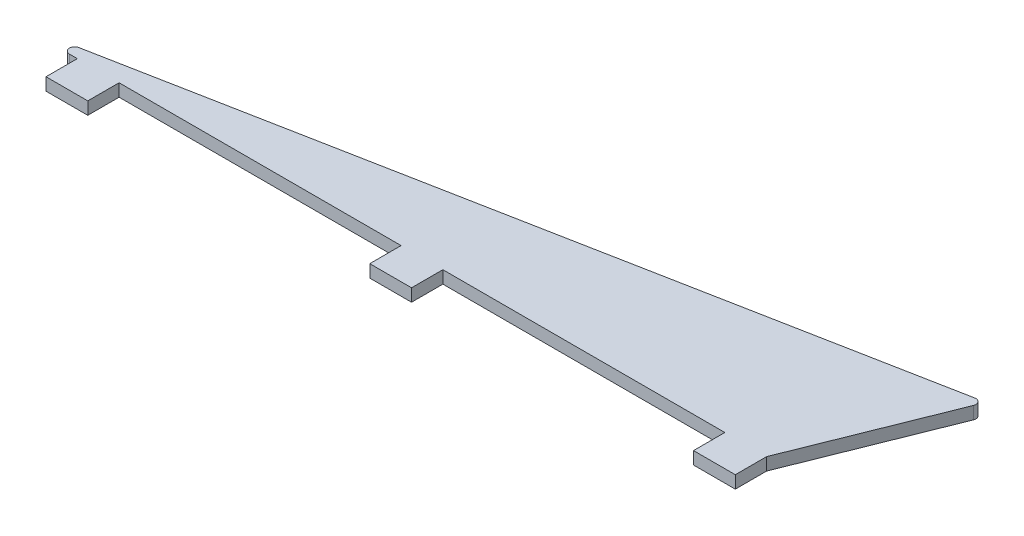
ISO-10303-21;
HEADER;
FILE_DESCRIPTION(('STEP AP214'),'2;1');
FILE_NAME('part.step','',(''),(''),'','','');
FILE_SCHEMA(('AUTOMOTIVE_DESIGN { 1 0 10303 214 1 1 1 1 }'));
ENDSEC;
DATA;
#1=APPLICATION_CONTEXT('core data for automotive mechanical design processes');
#2=APPLICATION_PROTOCOL_DEFINITION('international standard','automotive_design',2000,#1);
#3=PRODUCT_CONTEXT('',#1,'mechanical');
#4=PRODUCT('Part','Part','',(#3));
#5=PRODUCT_RELATED_PRODUCT_CATEGORY('part','',(#4));
#6=PRODUCT_DEFINITION_FORMATION('','',#4);
#7=PRODUCT_DEFINITION_CONTEXT('part definition',#1,'design');
#8=PRODUCT_DEFINITION('design','',#6,#7);
#9=PRODUCT_DEFINITION_SHAPE('','',#8);
#10=(LENGTH_UNIT() NAMED_UNIT(*) SI_UNIT(.MILLI.,.METRE.));
#11=(NAMED_UNIT(*) PLANE_ANGLE_UNIT() SI_UNIT($,.RADIAN.));
#12=(NAMED_UNIT(*) SI_UNIT($,.STERADIAN.) SOLID_ANGLE_UNIT());
#13=UNCERTAINTY_MEASURE_WITH_UNIT(LENGTH_MEASURE(1.E-05),#10,'distance_accuracy_value','');
#14=(GEOMETRIC_REPRESENTATION_CONTEXT(3) GLOBAL_UNCERTAINTY_ASSIGNED_CONTEXT((#13)) GLOBAL_UNIT_ASSIGNED_CONTEXT((#10,
#11,#12)) REPRESENTATION_CONTEXT('',''));
#15=CARTESIAN_POINT('',(0.,0.,0.));
#16=DIRECTION('',(0.,0.,1.));
#17=DIRECTION('',(1.,0.,0.));
#18=AXIS2_PLACEMENT_3D('',#15,#16,#17);
#19=CARTESIAN_POINT('',(0.,6.,0.));
#20=DIRECTION('',(1.,0.,0.));
#21=DIRECTION('',(0.,0.,-1.));
#22=AXIS2_PLACEMENT_3D('',#19,#20,#21);
#23=PLANE('',#22);
#24=DIRECTION('',(0.,0.,1.));
#25=VECTOR('',#24,1.);
#26=CARTESIAN_POINT('',(0.,0.,0.));
#27=LINE('',#26,#25);
#28=CARTESIAN_POINT('',(0.,0.,-15.));
#29=VERTEX_POINT('',#28);
#30=CARTESIAN_POINT('',(0.,0.,0.));
#31=VERTEX_POINT('',#30);
#32=EDGE_CURVE('E183',#29,#31,#27,.T.);
#33=ORIENTED_EDGE('',*,*,#32,.T.);
#34=DIRECTION('',(0.,-1.,0.));
#35=VECTOR('',#34,1.);
#36=CARTESIAN_POINT('',(0.,6.,0.));
#37=LINE('',#36,#35);
#38=CARTESIAN_POINT('',(0.,6.,0.));
#39=VERTEX_POINT('',#38);
#40=EDGE_CURVE('E11',#39,#31,#37,.T.);
#41=ORIENTED_EDGE('',*,*,#40,.F.);
#42=DIRECTION('',(0.,0.,1.));
#43=VECTOR('',#42,1.);
#44=CARTESIAN_POINT('',(0.,6.,0.));
#45=LINE('',#44,#43);
#46=CARTESIAN_POINT('',(0.,6.,-15.));
#47=VERTEX_POINT('',#46);
#48=EDGE_CURVE('E213',#47,#39,#45,.T.);
#49=ORIENTED_EDGE('',*,*,#48,.F.);
#50=DIRECTION('',(0.,-1.,0.));
#51=VECTOR('',#50,1.);
#52=CARTESIAN_POINT('',(0.,6.,-15.));
#53=LINE('',#52,#51);
#54=EDGE_CURVE('E179',#47,#29,#53,.T.);
#55=ORIENTED_EDGE('',*,*,#54,.T.);
#56=EDGE_LOOP('',(#33,#41,#49,#55));
#57=FACE_BOUND('',#56,.T.);
#58=ADVANCED_FACE('F39',(#57),#23,.F.);
#59=CARTESIAN_POINT('',(0.,6.,0.));
#60=DIRECTION('',(0.,0.,-1.));
#61=DIRECTION('',(-1.,0.,0.));
#62=AXIS2_PLACEMENT_3D('',#59,#60,#61);
#63=PLANE('',#62);
#64=DIRECTION('',(1.,0.,0.));
#65=VECTOR('',#64,1.);
#66=CARTESIAN_POINT('',(0.,0.,0.));
#67=LINE('',#66,#65);
#68=CARTESIAN_POINT('',(20.,0.,0.));
#69=VERTEX_POINT('',#68);
#70=EDGE_CURVE('E186',#31,#69,#67,.T.);
#71=ORIENTED_EDGE('',*,*,#70,.T.);
#72=DIRECTION('',(0.,-1.,0.));
#73=VECTOR('',#72,1.);
#74=CARTESIAN_POINT('',(20.,6.,0.));
#75=LINE('',#74,#73);
#76=CARTESIAN_POINT('',(20.,6.,0.));
#77=VERTEX_POINT('',#76);
#78=EDGE_CURVE('E47',#77,#69,#75,.T.);
#79=ORIENTED_EDGE('',*,*,#78,.F.);
#80=DIRECTION('',(1.,0.,0.));
#81=VECTOR('',#80,1.);
#82=CARTESIAN_POINT('',(0.,6.,0.));
#83=LINE('',#82,#81);
#84=EDGE_CURVE('E122',#39,#77,#83,.T.);
#85=ORIENTED_EDGE('',*,*,#84,.F.);
#86=ORIENTED_EDGE('',*,*,#40,.T.);
#87=EDGE_LOOP('',(#71,#79,#85,#86));
#88=FACE_BOUND('',#87,.T.);
#89=ADVANCED_FACE('F311',(#88),#63,.F.);
#90=CARTESIAN_POINT('',(20.,6.,0.));
#91=DIRECTION('',(-1.,0.,0.));
#92=DIRECTION('',(0.,0.,1.));
#93=AXIS2_PLACEMENT_3D('',#90,#91,#92);
#94=PLANE('',#93);
#95=DIRECTION('',(0.,0.,-1.));
#96=VECTOR('',#95,1.);
#97=CARTESIAN_POINT('',(20.,0.,0.));
#98=LINE('',#97,#96);
#99=CARTESIAN_POINT('',(20.,0.,-15.));
#100=VERTEX_POINT('',#99);
#101=EDGE_CURVE('E188',#69,#100,#98,.T.);
#102=ORIENTED_EDGE('',*,*,#101,.T.);
#103=DIRECTION('',(0.,-1.,0.));
#104=VECTOR('',#103,1.);
#105=CARTESIAN_POINT('',(20.,6.,-15.));
#106=LINE('',#105,#104);
#107=CARTESIAN_POINT('',(20.,6.,-15.));
#108=VERTEX_POINT('',#107);
#109=EDGE_CURVE('E244',#108,#100,#106,.T.);
#110=ORIENTED_EDGE('',*,*,#109,.F.);
#111=DIRECTION('',(0.,0.,-1.));
#112=VECTOR('',#111,1.);
#113=CARTESIAN_POINT('',(20.,6.,0.));
#114=LINE('',#113,#112);
#115=EDGE_CURVE('E252',#77,#108,#114,.T.);
#116=ORIENTED_EDGE('',*,*,#115,.F.);
#117=ORIENTED_EDGE('',*,*,#78,.T.);
#118=EDGE_LOOP('',(#102,#110,#116,#117));
#119=FACE_BOUND('',#118,.T.);
#120=ADVANCED_FACE('F250',(#119),#94,.F.);
#121=CARTESIAN_POINT('',(20.,6.,-15.));
#122=DIRECTION('',(0.,0.,-1.));
#123=DIRECTION('',(-1.,0.,0.));
#124=AXIS2_PLACEMENT_3D('',#121,#122,#123);
#125=PLANE('',#124);
#126=DIRECTION('',(1.,0.,0.));
#127=VECTOR('',#126,1.);
#128=CARTESIAN_POINT('',(20.,0.,-15.));
#129=LINE('',#128,#127);
#130=CARTESIAN_POINT('',(155.,0.,-15.));
#131=VERTEX_POINT('',#130);
#132=EDGE_CURVE('E190',#100,#131,#129,.T.);
#133=ORIENTED_EDGE('',*,*,#132,.T.);
#134=DIRECTION('',(0.,-1.,0.));
#135=VECTOR('',#134,1.);
#136=CARTESIAN_POINT('',(155.,6.,-15.));
#137=LINE('',#136,#135);
#138=CARTESIAN_POINT('',(155.,6.,-15.));
#139=VERTEX_POINT('',#138);
#140=EDGE_CURVE('E241',#139,#131,#137,.T.);
#141=ORIENTED_EDGE('',*,*,#140,.F.);
#142=DIRECTION('',(1.,0.,0.));
#143=VECTOR('',#142,1.);
#144=CARTESIAN_POINT('',(20.,6.,-15.));
#145=LINE('',#144,#143);
#146=EDGE_CURVE('E270',#108,#139,#145,.T.);
#147=ORIENTED_EDGE('',*,*,#146,.F.);
#148=ORIENTED_EDGE('',*,*,#109,.T.);
#149=EDGE_LOOP('',(#133,#141,#147,#148));
#150=FACE_BOUND('',#149,.T.);
#151=ADVANCED_FACE('F261',(#150),#125,.F.);
#152=CARTESIAN_POINT('',(155.,6.,-15.));
#153=DIRECTION('',(1.,0.,0.));
#154=DIRECTION('',(0.,0.,-1.));
#155=AXIS2_PLACEMENT_3D('',#152,#153,#154);
#156=PLANE('',#155);
#157=DIRECTION('',(0.,0.,1.));
#158=VECTOR('',#157,1.);
#159=CARTESIAN_POINT('',(155.,0.,-15.));
#160=LINE('',#159,#158);
#161=CARTESIAN_POINT('',(155.,0.,0.));
#162=VERTEX_POINT('',#161);
#163=EDGE_CURVE('E192',#131,#162,#160,.T.);
#164=ORIENTED_EDGE('',*,*,#163,.T.);
#165=DIRECTION('',(0.,-1.,0.));
#166=VECTOR('',#165,1.);
#167=CARTESIAN_POINT('',(155.,6.,0.));
#168=LINE('',#167,#166);
#169=CARTESIAN_POINT('',(155.,6.,0.));
#170=VERTEX_POINT('',#169);
#171=EDGE_CURVE('E238',#170,#162,#168,.T.);
#172=ORIENTED_EDGE('',*,*,#171,.F.);
#173=DIRECTION('',(0.,0.,1.));
#174=VECTOR('',#173,1.);
#175=CARTESIAN_POINT('',(155.,6.,-15.));
#176=LINE('',#175,#174);
#177=EDGE_CURVE('E267',#139,#170,#176,.T.);
#178=ORIENTED_EDGE('',*,*,#177,.F.);
#179=ORIENTED_EDGE('',*,*,#140,.T.);
#180=EDGE_LOOP('',(#164,#172,#178,#179));
#181=FACE_BOUND('',#180,.T.);
#182=ADVANCED_FACE('F265',(#181),#156,.F.);
#183=CARTESIAN_POINT('',(155.,6.,0.));
#184=DIRECTION('',(0.,0.,-1.));
#185=DIRECTION('',(-1.,0.,0.));
#186=AXIS2_PLACEMENT_3D('',#183,#184,#185);
#187=PLANE('',#186);
#188=DIRECTION('',(1.,0.,0.));
#189=VECTOR('',#188,1.);
#190=CARTESIAN_POINT('',(155.,0.,0.));
#191=LINE('',#190,#189);
#192=CARTESIAN_POINT('',(175.,0.,0.));
#193=VERTEX_POINT('',#192);
#194=EDGE_CURVE('E194',#162,#193,#191,.T.);
#195=ORIENTED_EDGE('',*,*,#194,.T.);
#196=DIRECTION('',(0.,-1.,0.));
#197=VECTOR('',#196,1.);
#198=CARTESIAN_POINT('',(175.,6.,0.));
#199=LINE('',#198,#197);
#200=CARTESIAN_POINT('',(175.,6.,0.));
#201=VERTEX_POINT('',#200);
#202=EDGE_CURVE('E235',#201,#193,#199,.T.);
#203=ORIENTED_EDGE('',*,*,#202,.F.);
#204=DIRECTION('',(1.,0.,0.));
#205=VECTOR('',#204,1.);
#206=CARTESIAN_POINT('',(155.,6.,0.));
#207=LINE('',#206,#205);
#208=EDGE_CURVE('E269',#170,#201,#207,.T.);
#209=ORIENTED_EDGE('',*,*,#208,.F.);
#210=ORIENTED_EDGE('',*,*,#171,.T.);
#211=EDGE_LOOP('',(#195,#203,#209,#210));
#212=FACE_BOUND('',#211,.T.);
#213=ADVANCED_FACE('F324',(#212),#187,.F.);
#214=CARTESIAN_POINT('',(175.,6.,0.));
#215=DIRECTION('',(-1.,0.,0.));
#216=DIRECTION('',(0.,0.,1.));
#217=AXIS2_PLACEMENT_3D('',#214,#215,#216);
#218=PLANE('',#217);
#219=DIRECTION('',(0.,0.,-1.));
#220=VECTOR('',#219,1.);
#221=CARTESIAN_POINT('',(175.,0.,0.));
#222=LINE('',#221,#220);
#223=CARTESIAN_POINT('',(175.,0.,-15.));
#224=VERTEX_POINT('',#223);
#225=EDGE_CURVE('E196',#193,#224,#222,.T.);
#226=ORIENTED_EDGE('',*,*,#225,.T.);
#227=DIRECTION('',(0.,-1.,0.));
#228=VECTOR('',#227,1.);
#229=CARTESIAN_POINT('',(175.,6.,-15.));
#230=LINE('',#229,#228);
#231=CARTESIAN_POINT('',(175.,6.,-15.));
#232=VERTEX_POINT('',#231);
#233=EDGE_CURVE('E232',#232,#224,#230,.T.);
#234=ORIENTED_EDGE('',*,*,#233,.F.);
#235=DIRECTION('',(0.,0.,-1.));
#236=VECTOR('',#235,1.);
#237=CARTESIAN_POINT('',(175.,6.,0.));
#238=LINE('',#237,#236);
#239=EDGE_CURVE('E272',#201,#232,#238,.T.);
#240=ORIENTED_EDGE('',*,*,#239,.F.);
#241=ORIENTED_EDGE('',*,*,#202,.T.);
#242=EDGE_LOOP('',(#226,#234,#240,#241));
#243=FACE_BOUND('',#242,.T.);
#244=ADVANCED_FACE('F327',(#243),#218,.F.);
#245=CARTESIAN_POINT('',(175.,6.,-15.));
#246=DIRECTION('',(0.,0.,-1.));
#247=DIRECTION('',(-1.,0.,0.));
#248=AXIS2_PLACEMENT_3D('',#245,#246,#247);
#249=PLANE('',#248);
#250=DIRECTION('',(1.,0.,0.));
#251=VECTOR('',#250,1.);
#252=CARTESIAN_POINT('',(175.,0.,-15.));
#253=LINE('',#252,#251);
#254=CARTESIAN_POINT('',(310.,0.,-15.));
#255=VERTEX_POINT('',#254);
#256=EDGE_CURVE('E198',#224,#255,#253,.T.);
#257=ORIENTED_EDGE('',*,*,#256,.T.);
#258=DIRECTION('',(0.,-1.,0.));
#259=VECTOR('',#258,1.);
#260=CARTESIAN_POINT('',(310.,6.,-15.));
#261=LINE('',#260,#259);
#262=CARTESIAN_POINT('',(310.,6.,-15.));
#263=VERTEX_POINT('',#262);
#264=EDGE_CURVE('E229',#263,#255,#261,.T.);
#265=ORIENTED_EDGE('',*,*,#264,.F.);
#266=DIRECTION('',(1.,0.,0.));
#267=VECTOR('',#266,1.);
#268=CARTESIAN_POINT('',(175.,6.,-15.));
#269=LINE('',#268,#267);
#270=EDGE_CURVE('E278',#232,#263,#269,.T.);
#271=ORIENTED_EDGE('',*,*,#270,.F.);
#272=ORIENTED_EDGE('',*,*,#233,.T.);
#273=EDGE_LOOP('',(#257,#265,#271,#272));
#274=FACE_BOUND('',#273,.T.);
#275=ADVANCED_FACE('F331',(#274),#249,.F.);
#276=CARTESIAN_POINT('',(310.,6.,-15.));
#277=DIRECTION('',(1.,0.,0.));
#278=DIRECTION('',(0.,0.,-1.));
#279=AXIS2_PLACEMENT_3D('',#276,#277,#278);
#280=PLANE('',#279);
#281=DIRECTION('',(0.,0.,1.));
#282=VECTOR('',#281,1.);
#283=CARTESIAN_POINT('',(310.,0.,-15.));
#284=LINE('',#283,#282);
#285=CARTESIAN_POINT('',(310.,0.,0.));
#286=VERTEX_POINT('',#285);
#287=EDGE_CURVE('E200',#255,#286,#284,.T.);
#288=ORIENTED_EDGE('',*,*,#287,.T.);
#289=DIRECTION('',(0.,-1.,0.));
#290=VECTOR('',#289,1.);
#291=CARTESIAN_POINT('',(310.,6.,0.));
#292=LINE('',#291,#290);
#293=CARTESIAN_POINT('',(310.,6.,0.));
#294=VERTEX_POINT('',#293);
#295=EDGE_CURVE('E226',#294,#286,#292,.T.);
#296=ORIENTED_EDGE('',*,*,#295,.F.);
#297=DIRECTION('',(0.,0.,1.));
#298=VECTOR('',#297,1.);
#299=CARTESIAN_POINT('',(310.,6.,-15.));
#300=LINE('',#299,#298);
#301=EDGE_CURVE('E280',#263,#294,#300,.T.);
#302=ORIENTED_EDGE('',*,*,#301,.F.);
#303=ORIENTED_EDGE('',*,*,#264,.T.);
#304=EDGE_LOOP('',(#288,#296,#302,#303));
#305=FACE_BOUND('',#304,.T.);
#306=ADVANCED_FACE('F335',(#305),#280,.F.);
#307=CARTESIAN_POINT('',(310.,6.,0.));
#308=DIRECTION('',(0.,0.,-1.));
#309=DIRECTION('',(-1.,0.,0.));
#310=AXIS2_PLACEMENT_3D('',#307,#308,#309);
#311=PLANE('',#310);
#312=DIRECTION('',(1.,0.,0.));
#313=VECTOR('',#312,1.);
#314=CARTESIAN_POINT('',(310.,0.,0.));
#315=LINE('',#314,#313);
#316=CARTESIAN_POINT('',(330.,0.,0.));
#317=VERTEX_POINT('',#316);
#318=EDGE_CURVE('E202',#286,#317,#315,.T.);
#319=ORIENTED_EDGE('',*,*,#318,.T.);
#320=DIRECTION('',(0.,-1.,0.));
#321=VECTOR('',#320,1.);
#322=CARTESIAN_POINT('',(330.,6.,0.));
#323=LINE('',#322,#321);
#324=CARTESIAN_POINT('',(330.,6.,0.));
#325=VERTEX_POINT('',#324);
#326=EDGE_CURVE('E223',#325,#317,#323,.T.);
#327=ORIENTED_EDGE('',*,*,#326,.F.);
#328=DIRECTION('',(1.,0.,0.));
#329=VECTOR('',#328,1.);
#330=CARTESIAN_POINT('',(310.,6.,0.));
#331=LINE('',#330,#329);
#332=EDGE_CURVE('E282',#294,#325,#331,.T.);
#333=ORIENTED_EDGE('',*,*,#332,.F.);
#334=ORIENTED_EDGE('',*,*,#295,.T.);
#335=EDGE_LOOP('',(#319,#327,#333,#334));
#336=FACE_BOUND('',#335,.T.);
#337=ADVANCED_FACE('F339',(#336),#311,.F.);
#338=CARTESIAN_POINT('',(330.,6.,0.));
#339=DIRECTION('',(-1.,0.,0.));
#340=DIRECTION('',(0.,0.,1.));
#341=AXIS2_PLACEMENT_3D('',#338,#339,#340);
#342=PLANE('',#341);
#343=DIRECTION('',(0.,0.,-1.));
#344=VECTOR('',#343,1.);
#345=CARTESIAN_POINT('',(330.,0.,0.));
#346=LINE('',#345,#344);
#347=CARTESIAN_POINT('',(330.,0.,-15.));
#348=VERTEX_POINT('',#347);
#349=EDGE_CURVE('E204',#317,#348,#346,.T.);
#350=ORIENTED_EDGE('',*,*,#349,.T.);
#351=DIRECTION('',(0.,-1.,0.));
#352=VECTOR('',#351,1.);
#353=CARTESIAN_POINT('',(330.,6.,-15.));
#354=LINE('',#353,#352);
#355=CARTESIAN_POINT('',(330.,6.,-15.));
#356=VERTEX_POINT('',#355);
#357=EDGE_CURVE('E220',#356,#348,#354,.T.);
#358=ORIENTED_EDGE('',*,*,#357,.F.);
#359=DIRECTION('',(0.,0.,-1.));
#360=VECTOR('',#359,1.);
#361=CARTESIAN_POINT('',(330.,6.,0.));
#362=LINE('',#361,#360);
#363=EDGE_CURVE('E284',#325,#356,#362,.T.);
#364=ORIENTED_EDGE('',*,*,#363,.F.);
#365=ORIENTED_EDGE('',*,*,#326,.T.);
#366=EDGE_LOOP('',(#350,#358,#364,#365));
#367=FACE_BOUND('',#366,.T.);
#368=ADVANCED_FACE('F343',(#367),#342,.F.);
#369=CARTESIAN_POINT('',(330.,6.,-15.));
#370=DIRECTION('',(-0.92847669088526,0.,-0.371390676354103));
#371=DIRECTION('',(-0.371390676354103,0.,0.92847669088526));
#372=AXIS2_PLACEMENT_3D('',#369,#370,#371);
#373=PLANE('',#372);
#374=DIRECTION('',(0.371390676354103,0.,-0.92847669088526));
#375=VECTOR('',#374,1.);
#376=CARTESIAN_POINT('',(330.,0.,-15.));
#377=LINE('',#376,#375);
#378=CARTESIAN_POINT('',(358.301043932109,0.,-85.7526098302728));
#379=VERTEX_POINT('',#378);
#380=EDGE_CURVE('E206',#348,#379,#377,.T.);
#381=ORIENTED_EDGE('',*,*,#380,.T.);
#382=DIRECTION('',(0.,-1.,0.));
#383=VECTOR('',#382,1.);
#384=CARTESIAN_POINT('',(358.301043932109,6.,-85.7526098302728));
#385=LINE('',#384,#383);
#386=CARTESIAN_POINT('',(358.301043932109,6.,-85.7526098302728));
#387=VERTEX_POINT('',#386);
#388=EDGE_CURVE('E217',#387,#379,#385,.T.);
#389=ORIENTED_EDGE('',*,*,#388,.F.);
#390=DIRECTION('',(0.371390676354103,0.,-0.92847669088526));
#391=VECTOR('',#390,1.);
#392=CARTESIAN_POINT('',(330.,6.,-15.));
#393=LINE('',#392,#391);
#394=EDGE_CURVE('E286',#356,#387,#393,.T.);
#395=ORIENTED_EDGE('',*,*,#394,.F.);
#396=ORIENTED_EDGE('',*,*,#357,.T.);
#397=EDGE_LOOP('',(#381,#389,#395,#396));
#398=FACE_BOUND('',#397,.T.);
#399=ADVANCED_FACE('F292',(#398),#373,.F.);
#400=CARTESIAN_POINT('',(355.979852204896,6.,-86.6810865211581));
#401=DIRECTION('',(0.,-1.,0.));
#402=DIRECTION('',(0.,0.,-1.));
#403=AXIS2_PLACEMENT_3D('',#400,#401,#402);
#404=CYLINDRICAL_SURFACE('',#403,2.5);
#405=CARTESIAN_POINT('',(355.979852204896,0.,-86.6810865211581));
#406=DIRECTION('',(0.,1.,0.));
#407=DIRECTION('',(0.,0.,-1.));
#408=AXIS2_PLACEMENT_3D('',#405,#406,#407);
#409=CIRCLE('',#408,2.5);
#410=CARTESIAN_POINT('',(355.507733720771,0.,-89.1361026386097));
#411=VERTEX_POINT('',#410);
#412=EDGE_CURVE('E208',#379,#411,#409,.T.);
#413=ORIENTED_EDGE('',*,*,#412,.T.);
#414=DIRECTION('',(0.,-1.,0.));
#415=VECTOR('',#414,1.);
#416=CARTESIAN_POINT('',(355.507733720771,6.,-89.1361026386097));
#417=LINE('',#416,#415);
#418=CARTESIAN_POINT('',(355.507733720771,6.,-89.1361026386097));
#419=VERTEX_POINT('',#418);
#420=EDGE_CURVE('E174',#419,#411,#417,.T.);
#421=ORIENTED_EDGE('',*,*,#420,.F.);
#422=CARTESIAN_POINT('',(355.979852204896,6.,-86.6810865211581));
#423=DIRECTION('',(0.,1.,0.));
#424=DIRECTION('',(0.,0.,-1.));
#425=AXIS2_PLACEMENT_3D('',#422,#423,#424);
#426=CIRCLE('',#425,2.5);
#427=EDGE_CURVE('E165',#387,#419,#426,.T.);
#428=ORIENTED_EDGE('',*,*,#427,.F.);
#429=ORIENTED_EDGE('',*,*,#388,.T.);
#430=EDGE_LOOP('',(#413,#421,#428,#429));
#431=FACE_BOUND('',#430,.T.);
#432=ADVANCED_FACE('F296',(#431),#404,.T.);
#433=CARTESIAN_POINT('',(-4.23391618925061,6.,-19.9550161174518));
#434=DIRECTION('',(0.188847393650124,0.,0.982006446980647));
#435=DIRECTION('',(0.982006446980647,0.,-0.188847393650124));
#436=AXIS2_PLACEMENT_3D('',#433,#434,#435);
#437=PLANE('',#436);
#438=DIRECTION('',(-0.982006446980647,0.,0.188847393650124));
#439=VECTOR('',#438,1.);
#440=CARTESIAN_POINT('',(-4.23391618925061,0.,-19.9550161174518));
#441=LINE('',#440,#439);
#442=CARTESIAN_POINT('',(-4.23391618925061,0.,-19.9550161174518));
#443=VERTEX_POINT('',#442);
#444=EDGE_CURVE('E173',#411,#443,#441,.T.);
#445=ORIENTED_EDGE('',*,*,#444,.T.);
#446=DIRECTION('',(0.,-1.,0.));
#447=VECTOR('',#446,1.);
#448=CARTESIAN_POINT('',(-4.23391618925061,6.,-19.9550161174518));
#449=LINE('',#448,#447);
#450=CARTESIAN_POINT('',(-4.23391618925061,6.,-19.9550161174518));
#451=VERTEX_POINT('',#450);
#452=EDGE_CURVE('E170',#451,#443,#449,.T.);
#453=ORIENTED_EDGE('',*,*,#452,.F.);
#454=DIRECTION('',(-0.982006446980647,0.,0.188847393650124));
#455=VECTOR('',#454,1.);
#456=CARTESIAN_POINT('',(-4.23391618925061,6.,-19.9550161174518));
#457=LINE('',#456,#455);
#458=EDGE_CURVE('E159',#419,#451,#457,.T.);
#459=ORIENTED_EDGE('',*,*,#458,.F.);
#460=ORIENTED_EDGE('',*,*,#420,.T.);
#461=EDGE_LOOP('',(#445,#453,#459,#460));
#462=FACE_BOUND('',#461,.T.);
#463=ADVANCED_FACE('F171',(#462),#437,.F.);
#464=CARTESIAN_POINT('',(-3.76179770512627,6.,-17.5));
#465=DIRECTION('',(0.,-1.,0.));
#466=DIRECTION('',(0.,0.,-1.));
#467=AXIS2_PLACEMENT_3D('',#464,#465,#466);
#468=CYLINDRICAL_SURFACE('',#467,2.5);
#469=CARTESIAN_POINT('',(-3.76179770512627,0.,-17.5));
#470=DIRECTION('',(0.,1.,0.));
#471=DIRECTION('',(0.,0.,-1.));
#472=AXIS2_PLACEMENT_3D('',#469,#470,#471);
#473=CIRCLE('',#472,2.5);
#474=CARTESIAN_POINT('',(-3.76179770512528,0.,-15.));
#475=VERTEX_POINT('',#474);
#476=EDGE_CURVE('E108',#443,#475,#473,.T.);
#477=ORIENTED_EDGE('',*,*,#476,.T.);
#478=DIRECTION('',(0.,-1.,0.));
#479=VECTOR('',#478,1.);
#480=CARTESIAN_POINT('',(-3.76179770512528,6.,-15.));
#481=LINE('',#480,#479);
#482=CARTESIAN_POINT('',(-3.76179770512528,6.,-15.));
#483=VERTEX_POINT('',#482);
#484=EDGE_CURVE('E175',#483,#475,#481,.T.);
#485=ORIENTED_EDGE('',*,*,#484,.F.);
#486=CARTESIAN_POINT('',(-3.76179770512627,6.,-17.5));
#487=DIRECTION('',(0.,1.,0.));
#488=DIRECTION('',(0.,0.,-1.));
#489=AXIS2_PLACEMENT_3D('',#486,#487,#488);
#490=CIRCLE('',#489,2.5);
#491=EDGE_CURVE('E163',#451,#483,#490,.T.);
#492=ORIENTED_EDGE('',*,*,#491,.F.);
#493=ORIENTED_EDGE('',*,*,#452,.T.);
#494=EDGE_LOOP('',(#477,#485,#492,#493));
#495=FACE_BOUND('',#494,.T.);
#496=ADVANCED_FACE('F177',(#495),#468,.T.);
#497=CARTESIAN_POINT('',(-3.76179770512528,6.,-15.));
#498=DIRECTION('',(0.,0.,-1.));
#499=DIRECTION('',(-1.,0.,0.));
#500=AXIS2_PLACEMENT_3D('',#497,#498,#499);
#501=PLANE('',#500);
#502=DIRECTION('',(1.,0.,0.));
#503=VECTOR('',#502,1.);
#504=CARTESIAN_POINT('',(-3.76179770512528,0.,-15.));
#505=LINE('',#504,#503);
#506=EDGE_CURVE('E114',#475,#29,#505,.T.);
#507=ORIENTED_EDGE('',*,*,#506,.T.);
#508=ORIENTED_EDGE('',*,*,#54,.F.);
#509=DIRECTION('',(1.,0.,0.));
#510=VECTOR('',#509,1.);
#511=CARTESIAN_POINT('',(-3.76179770512528,6.,-15.));
#512=LINE('',#511,#510);
#513=EDGE_CURVE('E55',#483,#47,#512,.T.);
#514=ORIENTED_EDGE('',*,*,#513,.F.);
#515=ORIENTED_EDGE('',*,*,#484,.T.);
#516=EDGE_LOOP('',(#507,#508,#514,#515));
#517=FACE_BOUND('',#516,.T.);
#518=ADVANCED_FACE('F300',(#517),#501,.F.);
#519=CARTESIAN_POINT('',(-3.76179770512627,6.,-17.5));
#520=DIRECTION('',(0.,-1.,0.));
#521=DIRECTION('',(0.,0.,-1.));
#522=AXIS2_PLACEMENT_3D('',#519,#520,#521);
#523=PLANE('',#522);
#524=ORIENTED_EDGE('',*,*,#48,.T.);
#525=ORIENTED_EDGE('',*,*,#84,.T.);
#526=ORIENTED_EDGE('',*,*,#115,.T.);
#527=ORIENTED_EDGE('',*,*,#146,.T.);
#528=ORIENTED_EDGE('',*,*,#177,.T.);
#529=ORIENTED_EDGE('',*,*,#208,.T.);
#530=ORIENTED_EDGE('',*,*,#239,.T.);
#531=ORIENTED_EDGE('',*,*,#270,.T.);
#532=ORIENTED_EDGE('',*,*,#301,.T.);
#533=ORIENTED_EDGE('',*,*,#332,.T.);
#534=ORIENTED_EDGE('',*,*,#363,.T.);
#535=ORIENTED_EDGE('',*,*,#394,.T.);
#536=ORIENTED_EDGE('',*,*,#427,.T.);
#537=ORIENTED_EDGE('',*,*,#458,.T.);
#538=ORIENTED_EDGE('',*,*,#491,.T.);
#539=ORIENTED_EDGE('',*,*,#513,.T.);
#540=EDGE_LOOP('',(#524,#525,#526,#527,#528,#529,#530,#531,#532,#533,#534,#535,#536,#537,#538,#539));
#541=FACE_BOUND('',#540,.T.);
#542=ADVANCED_FACE('F161',(#541),#523,.F.);
#543=CARTESIAN_POINT('',(-3.76179770512627,0.,-17.5));
#544=DIRECTION('',(0.,-1.,0.));
#545=DIRECTION('',(0.,0.,-1.));
#546=AXIS2_PLACEMENT_3D('',#543,#544,#545);
#547=PLANE('',#546);
#548=ORIENTED_EDGE('',*,*,#32,.F.);
#549=ORIENTED_EDGE('',*,*,#506,.F.);
#550=ORIENTED_EDGE('',*,*,#476,.F.);
#551=ORIENTED_EDGE('',*,*,#444,.F.);
#552=ORIENTED_EDGE('',*,*,#412,.F.);
#553=ORIENTED_EDGE('',*,*,#380,.F.);
#554=ORIENTED_EDGE('',*,*,#349,.F.);
#555=ORIENTED_EDGE('',*,*,#318,.F.);
#556=ORIENTED_EDGE('',*,*,#287,.F.);
#557=ORIENTED_EDGE('',*,*,#256,.F.);
#558=ORIENTED_EDGE('',*,*,#225,.F.);
#559=ORIENTED_EDGE('',*,*,#194,.F.);
#560=ORIENTED_EDGE('',*,*,#163,.F.);
#561=ORIENTED_EDGE('',*,*,#132,.F.);
#562=ORIENTED_EDGE('',*,*,#101,.F.);
#563=ORIENTED_EDGE('',*,*,#70,.F.);
#564=EDGE_LOOP('',(#548,#549,#550,#551,#552,#553,#554,#555,#556,#557,#558,#559,#560,#561,#562,#563));
#565=FACE_BOUND('',#564,.T.);
#566=ADVANCED_FACE('F256',(#565),#547,.T.);
#567=CLOSED_SHELL('',(#58,#89,#120,#151,#182,#213,#244,#275,#306,#337,#368,#399,#432,#463,#496,
#518,#542,#566));
#568=MANIFOLD_SOLID_BREP('B2',#567);
#569=ADVANCED_BREP_SHAPE_REPRESENTATION('',(#18,#568),#14);
#570=SHAPE_DEFINITION_REPRESENTATION(#9,#569);
ENDSEC;
END-ISO-10303-21;
